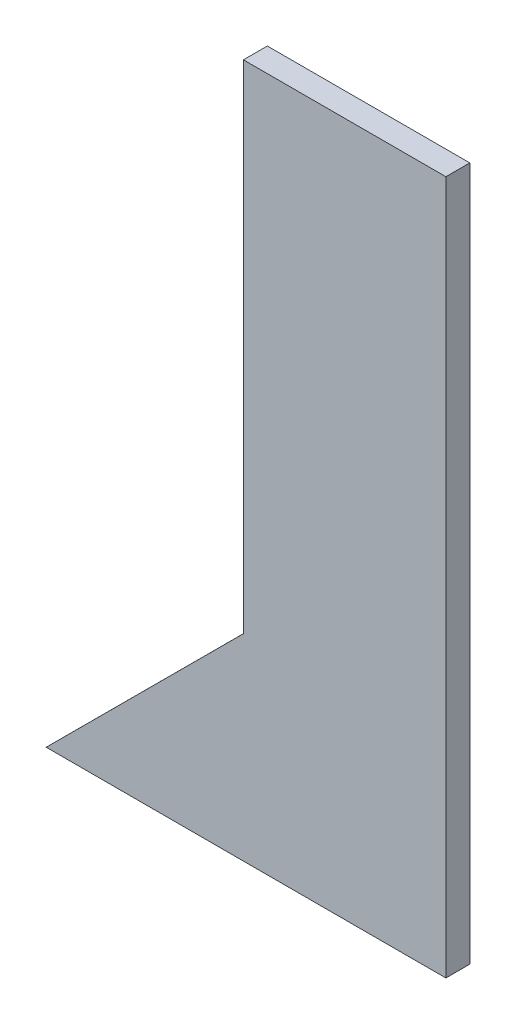
ISO-10303-21;
HEADER;
FILE_DESCRIPTION(('STEP AP214'),'2;1');
FILE_NAME('part.step','',(''),(''),'','','');
FILE_SCHEMA(('AUTOMOTIVE_DESIGN { 1 0 10303 214 1 1 1 1 }'));
ENDSEC;
DATA;
#1=APPLICATION_CONTEXT('core data for automotive mechanical design processes');
#2=APPLICATION_PROTOCOL_DEFINITION('international standard','automotive_design',2000,#1);
#3=PRODUCT_CONTEXT('',#1,'mechanical');
#4=PRODUCT('Part','Part','',(#3));
#5=PRODUCT_RELATED_PRODUCT_CATEGORY('part','',(#4));
#6=PRODUCT_DEFINITION_FORMATION('','',#4);
#7=PRODUCT_DEFINITION_CONTEXT('part definition',#1,'design');
#8=PRODUCT_DEFINITION('design','',#6,#7);
#9=PRODUCT_DEFINITION_SHAPE('','',#8);
#10=(LENGTH_UNIT() NAMED_UNIT(*) SI_UNIT(.MILLI.,.METRE.));
#11=(NAMED_UNIT(*) PLANE_ANGLE_UNIT() SI_UNIT($,.RADIAN.));
#12=(NAMED_UNIT(*) SI_UNIT($,.STERADIAN.) SOLID_ANGLE_UNIT());
#13=UNCERTAINTY_MEASURE_WITH_UNIT(LENGTH_MEASURE(1.E-05),#10,'distance_accuracy_value','');
#14=(GEOMETRIC_REPRESENTATION_CONTEXT(3) GLOBAL_UNCERTAINTY_ASSIGNED_CONTEXT((#13)) GLOBAL_UNIT_ASSIGNED_CONTEXT((#10,
#11,#12)) REPRESENTATION_CONTEXT('',''));
#15=CARTESIAN_POINT('',(0.,0.,0.));
#16=DIRECTION('',(0.,0.,1.));
#17=DIRECTION('',(1.,0.,0.));
#18=AXIS2_PLACEMENT_3D('',#15,#16,#17);
#19=CARTESIAN_POINT('',(6.15384615384615,15.,0.5));
#20=DIRECTION('',(0.,-1.,0.));
#21=DIRECTION('',(0.,0.,-1.));
#22=AXIS2_PLACEMENT_3D('',#19,#20,#21);
#23=PLANE('',#22);
#24=DIRECTION('',(1.,0.,0.));
#25=VECTOR('',#24,1.);
#26=CARTESIAN_POINT('',(6.15384615384615,15.,1.));
#27=LINE('',#26,#25);
#28=CARTESIAN_POINT('',(6.15384615384615,15.,1.));
#29=VERTEX_POINT('',#28);
#30=CARTESIAN_POINT('',(10.3846153846154,15.,1.));
#31=VERTEX_POINT('',#30);
#32=EDGE_CURVE('E111',#29,#31,#27,.T.);
#33=ORIENTED_EDGE('',*,*,#32,.T.);
#34=DIRECTION('',(0.,0.,1.));
#35=VECTOR('',#34,1.);
#36=CARTESIAN_POINT('',(10.3846153846154,15.,0.5));
#37=LINE('',#36,#35);
#38=CARTESIAN_POINT('',(10.3846153846154,15.,0.5));
#39=VERTEX_POINT('',#38);
#40=EDGE_CURVE('E45',#39,#31,#37,.T.);
#41=ORIENTED_EDGE('',*,*,#40,.F.);
#42=DIRECTION('',(1.,0.,0.));
#43=VECTOR('',#42,1.);
#44=CARTESIAN_POINT('',(6.15384615384615,15.,0.5));
#45=LINE('',#44,#43);
#46=CARTESIAN_POINT('',(6.15384615384615,15.,0.5));
#47=VERTEX_POINT('',#46);
#48=EDGE_CURVE('E112',#47,#39,#45,.T.);
#49=ORIENTED_EDGE('',*,*,#48,.F.);
#50=DIRECTION('',(0.,0.,1.));
#51=VECTOR('',#50,1.);
#52=CARTESIAN_POINT('',(6.15384615384615,15.,0.5));
#53=LINE('',#52,#51);
#54=EDGE_CURVE('E119',#47,#29,#53,.T.);
#55=ORIENTED_EDGE('',*,*,#54,.T.);
#56=EDGE_LOOP('',(#33,#41,#49,#55));
#57=FACE_BOUND('',#56,.T.);
#58=ADVANCED_FACE('F39',(#57),#23,.F.);
#59=CARTESIAN_POINT('',(6.15384615384615,4.61538461538461,0.5));
#60=DIRECTION('',(1.,0.,0.));
#61=DIRECTION('',(0.,0.,-1.));
#62=AXIS2_PLACEMENT_3D('',#59,#60,#61);
#63=PLANE('',#62);
#64=DIRECTION('',(0.,1.,0.));
#65=VECTOR('',#64,1.);
#66=CARTESIAN_POINT('',(6.15384615384615,4.61538461538461,1.));
#67=LINE('',#66,#65);
#68=CARTESIAN_POINT('',(6.15384615384615,4.61538461538461,1.));
#69=VERTEX_POINT('',#68);
#70=EDGE_CURVE('E79',#69,#29,#67,.T.);
#71=ORIENTED_EDGE('',*,*,#70,.T.);
#72=ORIENTED_EDGE('',*,*,#54,.F.);
#73=DIRECTION('',(0.,1.,0.));
#74=VECTOR('',#73,1.);
#75=CARTESIAN_POINT('',(6.15384615384615,4.61538461538461,0.5));
#76=LINE('',#75,#74);
#77=CARTESIAN_POINT('',(6.15384615384615,4.61538461538461,0.5));
#78=VERTEX_POINT('',#77);
#79=EDGE_CURVE('E65',#78,#47,#76,.T.);
#80=ORIENTED_EDGE('',*,*,#79,.F.);
#81=DIRECTION('',(0.,0.,1.));
#82=VECTOR('',#81,1.);
#83=CARTESIAN_POINT('',(6.15384615384615,4.61538461538461,0.5));
#84=LINE('',#83,#82);
#85=EDGE_CURVE('E120',#78,#69,#84,.T.);
#86=ORIENTED_EDGE('',*,*,#85,.T.);
#87=EDGE_LOOP('',(#71,#72,#80,#86));
#88=FACE_BOUND('',#87,.T.);
#89=ADVANCED_FACE('F135',(#88),#63,.F.);
#90=CARTESIAN_POINT('',(0.,0.,0.5));
#91=DIRECTION('',(0.,0.,-1.));
#92=DIRECTION('',(-1.,0.,0.));
#93=AXIS2_PLACEMENT_3D('',#90,#91,#92);
#94=PLANE('',#93);
#95=DIRECTION('',(1.,0.,0.));
#96=VECTOR('',#95,1.);
#97=CARTESIAN_POINT('',(0.,0.5,0.5));
#98=LINE('',#97,#96);
#99=CARTESIAN_POINT('',(2.0328317373461,0.5,0.5));
#100=VERTEX_POINT('',#99);
#101=CARTESIAN_POINT('',(10.3846153846154,0.5,0.5));
#102=VERTEX_POINT('',#101);
#103=EDGE_CURVE('E103',#100,#102,#98,.T.);
#104=ORIENTED_EDGE('',*,*,#103,.F.);
#105=DIRECTION('',(0.707589942466657,0.70662328953979,0.));
#106=VECTOR('',#105,1.);
#107=CARTESIAN_POINT('',(1.75480769230769,0.222355769230768,0.5));
#108=LINE('',#107,#106);
#109=EDGE_CURVE('E101',#100,#78,#108,.T.);
#110=ORIENTED_EDGE('',*,*,#109,.T.);
#111=ORIENTED_EDGE('',*,*,#79,.T.);
#112=ORIENTED_EDGE('',*,*,#48,.T.);
#113=DIRECTION('',(0.,-1.,0.));
#114=VECTOR('',#113,1.);
#115=CARTESIAN_POINT('',(10.3846153846154,15.,0.5));
#116=LINE('',#115,#114);
#117=EDGE_CURVE('E90',#39,#102,#116,.T.);
#118=ORIENTED_EDGE('',*,*,#117,.T.);
#119=EDGE_LOOP('',(#104,#110,#111,#112,#118));
#120=FACE_BOUND('',#119,.T.);
#121=ADVANCED_FACE('F127',(#120),#94,.T.);
#122=CARTESIAN_POINT('',(1.75480769230769,0.222355769230768,0.5));
#123=DIRECTION('',(0.70662328953979,-0.707589942466657,0.));
#124=DIRECTION('',(0.707589942466657,0.70662328953979,0.));
#125=AXIS2_PLACEMENT_3D('',#122,#123,#124);
#126=PLANE('',#125);
#127=ORIENTED_EDGE('',*,*,#109,.F.);
#128=DIRECTION('',(0.,0.,1.));
#129=VECTOR('',#128,1.);
#130=CARTESIAN_POINT('',(2.0328317373461,0.5,0.5));
#131=LINE('',#130,#129);
#132=CARTESIAN_POINT('',(2.0328317373461,0.5,1.));
#133=VERTEX_POINT('',#132);
#134=EDGE_CURVE('E53',#100,#133,#131,.T.);
#135=ORIENTED_EDGE('',*,*,#134,.T.);
#136=DIRECTION('',(0.707589942466657,0.70662328953979,0.));
#137=VECTOR('',#136,1.);
#138=CARTESIAN_POINT('',(1.75480769230769,0.222355769230768,1.));
#139=LINE('',#138,#137);
#140=EDGE_CURVE('E104',#133,#69,#139,.T.);
#141=ORIENTED_EDGE('',*,*,#140,.T.);
#142=ORIENTED_EDGE('',*,*,#85,.F.);
#143=EDGE_LOOP('',(#127,#135,#141,#142));
#144=FACE_BOUND('',#143,.T.);
#145=ADVANCED_FACE('F102',(#144),#126,.F.);
#146=CARTESIAN_POINT('',(10.3846153846154,15.,0.5));
#147=DIRECTION('',(-1.,0.,0.));
#148=DIRECTION('',(0.,0.,1.));
#149=AXIS2_PLACEMENT_3D('',#146,#147,#148);
#150=PLANE('',#149);
#151=DIRECTION('',(0.,-1.,0.));
#152=VECTOR('',#151,1.);
#153=CARTESIAN_POINT('',(10.3846153846154,15.,1.));
#154=LINE('',#153,#152);
#155=CARTESIAN_POINT('',(10.3846153846154,0.5,1.));
#156=VERTEX_POINT('',#155);
#157=EDGE_CURVE('E106',#31,#156,#154,.T.);
#158=ORIENTED_EDGE('',*,*,#157,.T.);
#159=DIRECTION('',(0.,0.,-1.));
#160=VECTOR('',#159,1.);
#161=CARTESIAN_POINT('',(10.3846153846154,0.5,0.5));
#162=LINE('',#161,#160);
#163=EDGE_CURVE('E94',#156,#102,#162,.T.);
#164=ORIENTED_EDGE('',*,*,#163,.T.);
#165=ORIENTED_EDGE('',*,*,#117,.F.);
#166=ORIENTED_EDGE('',*,*,#40,.T.);
#167=EDGE_LOOP('',(#158,#164,#165,#166));
#168=FACE_BOUND('',#167,.T.);
#169=ADVANCED_FACE('F123',(#168),#150,.F.);
#170=CARTESIAN_POINT('',(0.,0.,1.));
#171=DIRECTION('',(0.,0.,-1.));
#172=DIRECTION('',(-1.,0.,0.));
#173=AXIS2_PLACEMENT_3D('',#170,#171,#172);
#174=PLANE('',#173);
#175=ORIENTED_EDGE('',*,*,#140,.F.);
#176=DIRECTION('',(1.,0.,0.));
#177=VECTOR('',#176,1.);
#178=CARTESIAN_POINT('',(-17.,0.5,1.));
#179=LINE('',#178,#177);
#180=EDGE_CURVE('E11',#133,#156,#179,.T.);
#181=ORIENTED_EDGE('',*,*,#180,.T.);
#182=ORIENTED_EDGE('',*,*,#157,.F.);
#183=ORIENTED_EDGE('',*,*,#32,.F.);
#184=ORIENTED_EDGE('',*,*,#70,.F.);
#185=EDGE_LOOP('',(#175,#181,#182,#183,#184));
#186=FACE_BOUND('',#185,.T.);
#187=ADVANCED_FACE('F109',(#186),#174,.F.);
#188=CARTESIAN_POINT('',(-17.,0.5,1.));
#189=DIRECTION('',(0.,1.,0.));
#190=DIRECTION('',(0.,0.,1.));
#191=AXIS2_PLACEMENT_3D('',#188,#189,#190);
#192=PLANE('',#191);
#193=ORIENTED_EDGE('',*,*,#180,.F.);
#194=ORIENTED_EDGE('',*,*,#134,.F.);
#195=ORIENTED_EDGE('',*,*,#103,.T.);
#196=ORIENTED_EDGE('',*,*,#163,.F.);
#197=EDGE_LOOP('',(#193,#194,#195,#196));
#198=FACE_BOUND('',#197,.T.);
#199=ADVANCED_FACE('F92',(#198),#192,.F.);
#200=CLOSED_SHELL('',(#58,#89,#121,#145,#169,#187,#199));
#201=MANIFOLD_SOLID_BREP('B2',#200);
#202=ADVANCED_BREP_SHAPE_REPRESENTATION('',(#18,#201),#14);
#203=SHAPE_DEFINITION_REPRESENTATION(#9,#202);
ENDSEC;
END-ISO-10303-21;
